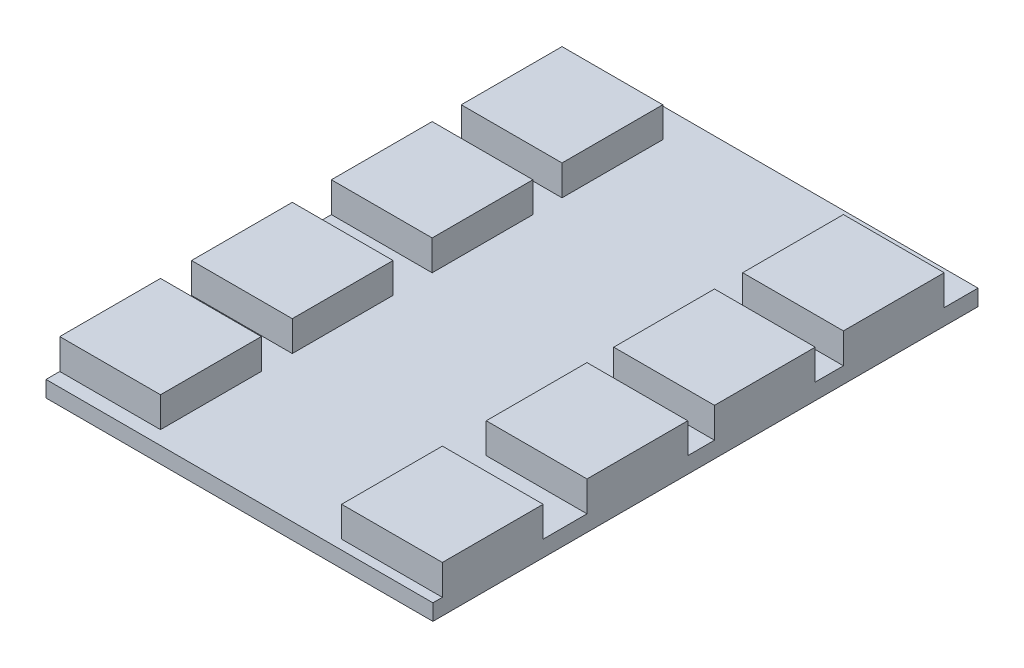
ISO-10303-21;
HEADER;
FILE_DESCRIPTION(('STEP AP214'),'2;1');
FILE_NAME('part.step','',(''),(''),'','','');
FILE_SCHEMA(('AUTOMOTIVE_DESIGN { 1 0 10303 214 1 1 1 1 }'));
ENDSEC;
DATA;
#1=APPLICATION_CONTEXT('core data for automotive mechanical design processes');
#2=APPLICATION_PROTOCOL_DEFINITION('international standard','automotive_design',2000,#1);
#3=PRODUCT_CONTEXT('',#1,'mechanical');
#4=PRODUCT('Part','Part','',(#3));
#5=PRODUCT_RELATED_PRODUCT_CATEGORY('part','',(#4));
#6=PRODUCT_DEFINITION_FORMATION('','',#4);
#7=PRODUCT_DEFINITION_CONTEXT('part definition',#1,'design');
#8=PRODUCT_DEFINITION('design','',#6,#7);
#9=PRODUCT_DEFINITION_SHAPE('','',#8);
#10=(LENGTH_UNIT() NAMED_UNIT(*) SI_UNIT(.MILLI.,.METRE.));
#11=(NAMED_UNIT(*) PLANE_ANGLE_UNIT() SI_UNIT($,.RADIAN.));
#12=(NAMED_UNIT(*) SI_UNIT($,.STERADIAN.) SOLID_ANGLE_UNIT());
#13=UNCERTAINTY_MEASURE_WITH_UNIT(LENGTH_MEASURE(1.E-05),#10,'distance_accuracy_value','');
#14=(GEOMETRIC_REPRESENTATION_CONTEXT(3) GLOBAL_UNCERTAINTY_ASSIGNED_CONTEXT((#13)) GLOBAL_UNIT_ASSIGNED_CONTEXT((#10,
#11,#12)) REPRESENTATION_CONTEXT('',''));
#15=CARTESIAN_POINT('',(0.,0.,0.));
#16=DIRECTION('',(0.,0.,1.));
#17=DIRECTION('',(1.,0.,0.));
#18=AXIS2_PLACEMENT_3D('',#15,#16,#17);
#19=CARTESIAN_POINT('',(0.,0.8,0.));
#20=DIRECTION('',(0.,-1.,0.));
#21=DIRECTION('',(0.,0.,-1.));
#22=AXIS2_PLACEMENT_3D('',#19,#20,#21);
#23=PLANE('',#22);
#24=DIRECTION('',(1.,0.,0.));
#25=VECTOR('',#24,1.);
#26=CARTESIAN_POINT('',(19.2,0.8,-13.6924671357661));
#27=LINE('',#26,#25);
#28=CARTESIAN_POINT('',(9.20000000000001,0.8,-13.6924671357661));
#29=VERTEX_POINT('',#28);
#30=CARTESIAN_POINT('',(19.2,0.8,-13.6924671357661));
#31=VERTEX_POINT('',#30);
#32=EDGE_CURVE('E60',#29,#31,#27,.T.);
#33=ORIENTED_EDGE('',*,*,#32,.F.);
#34=DIRECTION('',(0.,0.,1.));
#35=VECTOR('',#34,1.);
#36=CARTESIAN_POINT('',(9.20000000000001,0.8,-23.6924671357661));
#37=LINE('',#36,#35);
#38=CARTESIAN_POINT('',(9.20000000000001,0.8,-23.6924671357661));
#39=VERTEX_POINT('',#38);
#40=EDGE_CURVE('E417',#39,#29,#37,.T.);
#41=ORIENTED_EDGE('',*,*,#40,.F.);
#42=DIRECTION('',(-1.,0.,0.));
#43=VECTOR('',#42,1.);
#44=CARTESIAN_POINT('',(19.2,0.8,-23.6924671357661));
#45=LINE('',#44,#43);
#46=CARTESIAN_POINT('',(19.2,0.8,-23.6924671357661));
#47=VERTEX_POINT('',#46);
#48=EDGE_CURVE('E379',#47,#39,#45,.T.);
#49=ORIENTED_EDGE('',*,*,#48,.F.);
#50=DIRECTION('',(0.,0.,-1.));
#51=VECTOR('',#50,1.);
#52=CARTESIAN_POINT('',(19.2,0.8,27.05));
#53=LINE('',#52,#51);
#54=CARTESIAN_POINT('',(19.2,0.8,-27.05));
#55=VERTEX_POINT('',#54);
#56=EDGE_CURVE('E523',#47,#55,#53,.T.);
#57=ORIENTED_EDGE('',*,*,#56,.T.);
#58=DIRECTION('',(-1.,0.,0.));
#59=VECTOR('',#58,1.);
#60=CARTESIAN_POINT('',(-19.2,0.8,-27.05));
#61=LINE('',#60,#59);
#62=CARTESIAN_POINT('',(-19.2,0.8,-27.05));
#63=VERTEX_POINT('',#62);
#64=EDGE_CURVE('E521',#55,#63,#61,.T.);
#65=ORIENTED_EDGE('',*,*,#64,.T.);
#66=DIRECTION('',(0.,0.,1.));
#67=VECTOR('',#66,1.);
#68=CARTESIAN_POINT('',(-19.2,0.8,27.05));
#69=LINE('',#68,#67);
#70=CARTESIAN_POINT('',(-19.2,0.8,-24.1646211749305));
#71=VERTEX_POINT('',#70);
#72=EDGE_CURVE('E526',#63,#71,#69,.T.);
#73=ORIENTED_EDGE('',*,*,#72,.T.);
#74=DIRECTION('',(-1.,0.,0.));
#75=VECTOR('',#74,1.);
#76=CARTESIAN_POINT('',(-19.2,0.8,-24.1646211749305));
#77=LINE('',#76,#75);
#78=CARTESIAN_POINT('',(-9.2,0.8,-24.1646211749305));
#79=VERTEX_POINT('',#78);
#80=EDGE_CURVE('E493',#79,#71,#77,.T.);
#81=ORIENTED_EDGE('',*,*,#80,.F.);
#82=DIRECTION('',(0.,0.,-1.));
#83=VECTOR('',#82,1.);
#84=CARTESIAN_POINT('',(-9.2,0.8,-24.1646211749305));
#85=LINE('',#84,#83);
#86=CARTESIAN_POINT('',(-9.2,0.8,-14.1646211749305));
#87=VERTEX_POINT('',#86);
#88=EDGE_CURVE('E502',#87,#79,#85,.T.);
#89=ORIENTED_EDGE('',*,*,#88,.F.);
#90=DIRECTION('',(1.,0.,0.));
#91=VECTOR('',#90,1.);
#92=CARTESIAN_POINT('',(-19.2,0.8,-14.1646211749305));
#93=LINE('',#92,#91);
#94=CARTESIAN_POINT('',(-19.2,0.8,-14.1646211749305));
#95=VERTEX_POINT('',#94);
#96=EDGE_CURVE('E453',#95,#87,#93,.T.);
#97=ORIENTED_EDGE('',*,*,#96,.F.);
#98=CARTESIAN_POINT('',(-19.2,0.8,-11.2748159057438));
#99=VERTEX_POINT('',#98);
#100=EDGE_CURVE('E529',#95,#99,#69,.T.);
#101=ORIENTED_EDGE('',*,*,#100,.T.);
#102=DIRECTION('',(-1.,0.,0.));
#103=VECTOR('',#102,1.);
#104=CARTESIAN_POINT('',(-19.2,0.8,-11.2748159057438));
#105=LINE('',#104,#103);
#106=CARTESIAN_POINT('',(-9.2,0.8,-11.2748159057438));
#107=VERTEX_POINT('',#106);
#108=EDGE_CURVE('E443',#107,#99,#105,.T.);
#109=ORIENTED_EDGE('',*,*,#108,.F.);
#110=DIRECTION('',(0.,0.,-1.));
#111=VECTOR('',#110,1.);
#112=CARTESIAN_POINT('',(-9.2,0.8,-11.2748159057438));
#113=LINE('',#112,#111);
#114=CARTESIAN_POINT('',(-9.2,0.8,-1.27481590574375));
#115=VERTEX_POINT('',#114);
#116=EDGE_CURVE('E446',#115,#107,#113,.T.);
#117=ORIENTED_EDGE('',*,*,#116,.F.);
#118=DIRECTION('',(1.,0.,0.));
#119=VECTOR('',#118,1.);
#120=CARTESIAN_POINT('',(-19.2,0.8,-1.27481590574375));
#121=LINE('',#120,#119);
#122=CARTESIAN_POINT('',(-19.2,0.8,-1.27481590574375));
#123=VERTEX_POINT('',#122);
#124=EDGE_CURVE('E450',#123,#115,#121,.T.);
#125=ORIENTED_EDGE('',*,*,#124,.F.);
#126=CARTESIAN_POINT('',(-19.2,0.8,2.6065128456881));
#127=VERTEX_POINT('',#126);
#128=EDGE_CURVE('E1119',#123,#127,#69,.T.);
#129=ORIENTED_EDGE('',*,*,#128,.T.);
#130=DIRECTION('',(-1.,0.,0.));
#131=VECTOR('',#130,1.);
#132=CARTESIAN_POINT('',(-19.2,0.8,2.6065128456881));
#133=LINE('',#132,#131);
#134=CARTESIAN_POINT('',(-9.19999999999999,0.8,2.6065128456881));
#135=VERTEX_POINT('',#134);
#136=EDGE_CURVE('E473',#135,#127,#133,.T.);
#137=ORIENTED_EDGE('',*,*,#136,.F.);
#138=DIRECTION('',(0.,0.,-1.));
#139=VECTOR('',#138,1.);
#140=CARTESIAN_POINT('',(-9.19999999999999,0.8,2.6065128456881));
#141=LINE('',#140,#139);
#142=CARTESIAN_POINT('',(-9.2,0.8,12.6065128456881));
#143=VERTEX_POINT('',#142);
#144=EDGE_CURVE('E476',#143,#135,#141,.T.);
#145=ORIENTED_EDGE('',*,*,#144,.F.);
#146=DIRECTION('',(1.,0.,0.));
#147=VECTOR('',#146,1.);
#148=CARTESIAN_POINT('',(-19.2,0.8,12.6065128456881));
#149=LINE('',#148,#147);
#150=CARTESIAN_POINT('',(-19.2,0.8,12.6065128456881));
#151=VERTEX_POINT('',#150);
#152=EDGE_CURVE('E433',#151,#143,#149,.T.);
#153=ORIENTED_EDGE('',*,*,#152,.F.);
#154=CARTESIAN_POINT('',(-19.2,0.8,15.6851797305405));
#155=VERTEX_POINT('',#154);
#156=EDGE_CURVE('E1117',#151,#155,#69,.T.);
#157=ORIENTED_EDGE('',*,*,#156,.T.);
#158=DIRECTION('',(-1.,0.,0.));
#159=VECTOR('',#158,1.);
#160=CARTESIAN_POINT('',(-19.2,0.8,15.6851797305405));
#161=LINE('',#160,#159);
#162=CARTESIAN_POINT('',(-9.2,0.8,15.6851797305405));
#163=VERTEX_POINT('',#162);
#164=EDGE_CURVE('E67',#163,#155,#161,.T.);
#165=ORIENTED_EDGE('',*,*,#164,.F.);
#166=DIRECTION('',(0.,0.,-1.));
#167=VECTOR('',#166,1.);
#168=CARTESIAN_POINT('',(-9.2,0.8,15.6851797305405));
#169=LINE('',#168,#167);
#170=CARTESIAN_POINT('',(-9.19999999999999,0.8,25.6851797305405));
#171=VERTEX_POINT('',#170);
#172=EDGE_CURVE('E390',#171,#163,#169,.T.);
#173=ORIENTED_EDGE('',*,*,#172,.F.);
#174=DIRECTION('',(1.,0.,0.));
#175=VECTOR('',#174,1.);
#176=CARTESIAN_POINT('',(-19.2,0.8,25.6851797305405));
#177=LINE('',#176,#175);
#178=CARTESIAN_POINT('',(-19.2,0.8,25.6851797305405));
#179=VERTEX_POINT('',#178);
#180=EDGE_CURVE('E393',#179,#171,#177,.T.);
#181=ORIENTED_EDGE('',*,*,#180,.F.);
#182=CARTESIAN_POINT('',(-19.2,0.8,27.05));
#183=VERTEX_POINT('',#182);
#184=EDGE_CURVE('E525',#179,#183,#69,.T.);
#185=ORIENTED_EDGE('',*,*,#184,.T.);
#186=DIRECTION('',(1.,0.,0.));
#187=VECTOR('',#186,1.);
#188=CARTESIAN_POINT('',(-19.2,0.8,27.05));
#189=LINE('',#188,#187);
#190=CARTESIAN_POINT('',(19.2,0.8,27.05));
#191=VERTEX_POINT('',#190);
#192=EDGE_CURVE('E528',#183,#191,#189,.T.);
#193=ORIENTED_EDGE('',*,*,#192,.T.);
#194=CARTESIAN_POINT('',(19.2,0.8,26.1101183657885));
#195=VERTEX_POINT('',#194);
#196=EDGE_CURVE('E519',#191,#195,#53,.T.);
#197=ORIENTED_EDGE('',*,*,#196,.T.);
#198=DIRECTION('',(1.,0.,0.));
#199=VECTOR('',#198,1.);
#200=CARTESIAN_POINT('',(19.2,0.8,26.1101183657885));
#201=LINE('',#200,#199);
#202=CARTESIAN_POINT('',(9.20000000000002,0.8,26.1101183657885));
#203=VERTEX_POINT('',#202);
#204=EDGE_CURVE('E359',#203,#195,#201,.T.);
#205=ORIENTED_EDGE('',*,*,#204,.F.);
#206=DIRECTION('',(0.,0.,1.));
#207=VECTOR('',#206,1.);
#208=CARTESIAN_POINT('',(9.20000000000002,0.8,16.1101183657885));
#209=LINE('',#208,#207);
#210=CARTESIAN_POINT('',(9.20000000000002,0.8,16.1101183657885));
#211=VERTEX_POINT('',#210);
#212=EDGE_CURVE('E362',#211,#203,#209,.T.);
#213=ORIENTED_EDGE('',*,*,#212,.F.);
#214=DIRECTION('',(-1.,0.,0.));
#215=VECTOR('',#214,1.);
#216=CARTESIAN_POINT('',(19.2,0.8,16.1101183657885));
#217=LINE('',#216,#215);
#218=CARTESIAN_POINT('',(19.2,0.8,16.1101183657885));
#219=VERTEX_POINT('',#218);
#220=EDGE_CURVE('E320',#219,#211,#217,.T.);
#221=ORIENTED_EDGE('',*,*,#220,.F.);
#222=CARTESIAN_POINT('',(19.2,0.8,11.7566355751923));
#223=VERTEX_POINT('',#222);
#224=EDGE_CURVE('E522',#219,#223,#53,.T.);
#225=ORIENTED_EDGE('',*,*,#224,.T.);
#226=DIRECTION('',(1.,0.,0.));
#227=VECTOR('',#226,1.);
#228=CARTESIAN_POINT('',(19.2,0.8,11.7566355751923));
#229=LINE('',#228,#227);
#230=CARTESIAN_POINT('',(9.20000000000001,0.8,11.7566355751923));
#231=VERTEX_POINT('',#230);
#232=EDGE_CURVE('E330',#231,#223,#229,.T.);
#233=ORIENTED_EDGE('',*,*,#232,.F.);
#234=DIRECTION('',(0.,0.,1.));
#235=VECTOR('',#234,1.);
#236=CARTESIAN_POINT('',(9.20000000000001,0.8,1.75663557519226));
#237=LINE('',#236,#235);
#238=CARTESIAN_POINT('',(9.20000000000001,0.8,1.75663557519226));
#239=VERTEX_POINT('',#238);
#240=EDGE_CURVE('E333',#239,#231,#237,.T.);
#241=ORIENTED_EDGE('',*,*,#240,.F.);
#242=DIRECTION('',(-1.,0.,0.));
#243=VECTOR('',#242,1.);
#244=CARTESIAN_POINT('',(19.2,0.8,1.75663557519226));
#245=LINE('',#244,#243);
#246=CARTESIAN_POINT('',(19.2,0.8,1.75663557519226));
#247=VERTEX_POINT('',#246);
#248=EDGE_CURVE('E302',#247,#239,#245,.T.);
#249=ORIENTED_EDGE('',*,*,#248,.F.);
#250=CARTESIAN_POINT('',(19.2,0.8,-0.897092674412271));
#251=VERTEX_POINT('',#250);
#252=EDGE_CURVE('E580',#247,#251,#53,.T.);
#253=ORIENTED_EDGE('',*,*,#252,.T.);
#254=DIRECTION('',(1.,0.,0.));
#255=VECTOR('',#254,1.);
#256=CARTESIAN_POINT('',(19.2,0.8,-0.897092674412271));
#257=LINE('',#256,#255);
#258=CARTESIAN_POINT('',(9.20000000000001,0.8,-0.89709267441227));
#259=VERTEX_POINT('',#258);
#260=EDGE_CURVE('E280',#259,#251,#257,.T.);
#261=ORIENTED_EDGE('',*,*,#260,.F.);
#262=DIRECTION('',(0.,0.,1.));
#263=VECTOR('',#262,1.);
#264=CARTESIAN_POINT('',(9.20000000000001,0.8,-10.8970926744123));
#265=LINE('',#264,#263);
#266=CARTESIAN_POINT('',(9.20000000000001,0.8,-10.8970926744123));
#267=VERTEX_POINT('',#266);
#268=EDGE_CURVE('E275',#267,#259,#265,.T.);
#269=ORIENTED_EDGE('',*,*,#268,.F.);
#270=DIRECTION('',(-1.,0.,0.));
#271=VECTOR('',#270,1.);
#272=CARTESIAN_POINT('',(19.2,0.8,-10.8970926744123));
#273=LINE('',#272,#271);
#274=CARTESIAN_POINT('',(19.2,0.8,-10.8970926744123));
#275=VERTEX_POINT('',#274);
#276=EDGE_CURVE('E277',#275,#267,#273,.T.);
#277=ORIENTED_EDGE('',*,*,#276,.F.);
#278=EDGE_CURVE('E581',#275,#31,#53,.T.);
#279=ORIENTED_EDGE('',*,*,#278,.T.);
#280=EDGE_LOOP('',(#33,#41,#49,#57,#65,#73,#81,#89,#97,#101,#109,#117,#125,#129,#137,#145,#153,
#157,#165,#173,#181,#185,#193,#197,#205,#213,#221,#225,#233,#241,#249,#253,#261,#269,#277,#279));
#281=FACE_BOUND('',#280,.T.);
#282=ADVANCED_FACE('F45',(#281),#23,.F.);
#283=CARTESIAN_POINT('',(19.2,0.8,27.05));
#284=DIRECTION('',(-1.,0.,0.));
#285=DIRECTION('',(0.,0.,1.));
#286=AXIS2_PLACEMENT_3D('',#283,#284,#285);
#287=PLANE('',#286);
#288=DIRECTION('',(0.,0.,-1.));
#289=VECTOR('',#288,1.);
#290=CARTESIAN_POINT('',(19.2,-0.8,27.05));
#291=LINE('',#290,#289);
#292=CARTESIAN_POINT('',(19.2,-0.8,27.05));
#293=VERTEX_POINT('',#292);
#294=CARTESIAN_POINT('',(19.2,-0.8,-27.05));
#295=VERTEX_POINT('',#294);
#296=EDGE_CURVE('E518',#293,#295,#291,.T.);
#297=ORIENTED_EDGE('',*,*,#296,.T.);
#298=DIRECTION('',(0.,-1.,0.));
#299=VECTOR('',#298,1.);
#300=CARTESIAN_POINT('',(19.2,0.8,-27.05));
#301=LINE('',#300,#299);
#302=EDGE_CURVE('E11',#55,#295,#301,.T.);
#303=ORIENTED_EDGE('',*,*,#302,.F.);
#304=ORIENTED_EDGE('',*,*,#56,.F.);
#305=DIRECTION('',(0.,-1.,0.));
#306=VECTOR('',#305,1.);
#307=CARTESIAN_POINT('',(19.2,3.8,-23.6924671357661));
#308=LINE('',#307,#306);
#309=CARTESIAN_POINT('',(19.2,3.8,-23.6924671357661));
#310=VERTEX_POINT('',#309);
#311=EDGE_CURVE('E294',#310,#47,#308,.T.);
#312=ORIENTED_EDGE('',*,*,#311,.F.);
#313=DIRECTION('',(0.,0.,-1.));
#314=VECTOR('',#313,1.);
#315=CARTESIAN_POINT('',(19.2,3.8,-23.6924671357661));
#316=LINE('',#315,#314);
#317=CARTESIAN_POINT('',(19.2,3.8,-13.6924671357661));
#318=VERTEX_POINT('',#317);
#319=EDGE_CURVE('E418',#318,#310,#316,.T.);
#320=ORIENTED_EDGE('',*,*,#319,.F.);
#321=DIRECTION('',(0.,-1.,0.));
#322=VECTOR('',#321,1.);
#323=CARTESIAN_POINT('',(19.2,3.8,-13.6924671357661));
#324=LINE('',#323,#322);
#325=EDGE_CURVE('E412',#318,#31,#324,.T.);
#326=ORIENTED_EDGE('',*,*,#325,.T.);
#327=ORIENTED_EDGE('',*,*,#278,.F.);
#328=DIRECTION('',(0.,-1.,0.));
#329=VECTOR('',#328,1.);
#330=CARTESIAN_POINT('',(19.2,3.8,-10.8970926744123));
#331=LINE('',#330,#329);
#332=CARTESIAN_POINT('',(19.2,3.8,-10.8970926744123));
#333=VERTEX_POINT('',#332);
#334=EDGE_CURVE('E293',#333,#275,#331,.T.);
#335=ORIENTED_EDGE('',*,*,#334,.F.);
#336=DIRECTION('',(0.,0.,-1.));
#337=VECTOR('',#336,1.);
#338=CARTESIAN_POINT('',(19.2,3.8,-10.8970926744123));
#339=LINE('',#338,#337);
#340=CARTESIAN_POINT('',(19.2,3.8,-0.897092674412271));
#341=VERTEX_POINT('',#340);
#342=EDGE_CURVE('E308',#341,#333,#339,.T.);
#343=ORIENTED_EDGE('',*,*,#342,.F.);
#344=DIRECTION('',(0.,-1.,0.));
#345=VECTOR('',#344,1.);
#346=CARTESIAN_POINT('',(19.2,3.8,-0.897092674412271));
#347=LINE('',#346,#345);
#348=EDGE_CURVE('E300',#341,#251,#347,.T.);
#349=ORIENTED_EDGE('',*,*,#348,.T.);
#350=ORIENTED_EDGE('',*,*,#252,.F.);
#351=DIRECTION('',(0.,-1.,0.));
#352=VECTOR('',#351,1.);
#353=CARTESIAN_POINT('',(19.2,3.8,1.75663557519226));
#354=LINE('',#353,#352);
#355=CARTESIAN_POINT('',(19.2,3.8,1.75663557519226));
#356=VERTEX_POINT('',#355);
#357=EDGE_CURVE('E316',#356,#247,#354,.T.);
#358=ORIENTED_EDGE('',*,*,#357,.F.);
#359=DIRECTION('',(0.,0.,-1.));
#360=VECTOR('',#359,1.);
#361=CARTESIAN_POINT('',(19.2,3.8,1.75663557519226));
#362=LINE('',#361,#360);
#363=CARTESIAN_POINT('',(19.2,3.8,11.7566355751923));
#364=VERTEX_POINT('',#363);
#365=EDGE_CURVE('E334',#364,#356,#362,.T.);
#366=ORIENTED_EDGE('',*,*,#365,.F.);
#367=DIRECTION('',(0.,-1.,0.));
#368=VECTOR('',#367,1.);
#369=CARTESIAN_POINT('',(19.2,3.8,11.7566355751923));
#370=LINE('',#369,#368);
#371=EDGE_CURVE('E326',#364,#223,#370,.T.);
#372=ORIENTED_EDGE('',*,*,#371,.T.);
#373=ORIENTED_EDGE('',*,*,#224,.F.);
#374=DIRECTION('',(0.,-1.,0.));
#375=VECTOR('',#374,1.);
#376=CARTESIAN_POINT('',(19.2,3.8,16.1101183657885));
#377=LINE('',#376,#375);
#378=CARTESIAN_POINT('',(19.2,3.8,16.1101183657885));
#379=VERTEX_POINT('',#378);
#380=EDGE_CURVE('E346',#379,#219,#377,.T.);
#381=ORIENTED_EDGE('',*,*,#380,.F.);
#382=DIRECTION('',(0.,0.,-1.));
#383=VECTOR('',#382,1.);
#384=CARTESIAN_POINT('',(19.2,3.8,16.1101183657885));
#385=LINE('',#384,#383);
#386=CARTESIAN_POINT('',(19.2,3.8,26.1101183657885));
#387=VERTEX_POINT('',#386);
#388=EDGE_CURVE('E363',#387,#379,#385,.T.);
#389=ORIENTED_EDGE('',*,*,#388,.F.);
#390=DIRECTION('',(0.,-1.,0.));
#391=VECTOR('',#390,1.);
#392=CARTESIAN_POINT('',(19.2,3.8,26.1101183657885));
#393=LINE('',#392,#391);
#394=EDGE_CURVE('E355',#387,#195,#393,.T.);
#395=ORIENTED_EDGE('',*,*,#394,.T.);
#396=ORIENTED_EDGE('',*,*,#196,.F.);
#397=DIRECTION('',(0.,-1.,0.));
#398=VECTOR('',#397,1.);
#399=CARTESIAN_POINT('',(19.2,0.8,27.05));
#400=LINE('',#399,#398);
#401=EDGE_CURVE('E531',#191,#293,#400,.T.);
#402=ORIENTED_EDGE('',*,*,#401,.T.);
#403=EDGE_LOOP('',(#297,#303,#304,#312,#320,#326,#327,#335,#343,#349,#350,#358,#366,#372,#373,
#381,#389,#395,#396,#402));
#404=FACE_BOUND('',#403,.T.);
#405=ADVANCED_FACE('F47',(#404),#287,.F.);
#406=CARTESIAN_POINT('',(-19.2,0.8,-27.05));
#407=DIRECTION('',(0.,0.,1.));
#408=DIRECTION('',(1.,0.,0.));
#409=AXIS2_PLACEMENT_3D('',#406,#407,#408);
#410=PLANE('',#409);
#411=DIRECTION('',(-1.,0.,0.));
#412=VECTOR('',#411,1.);
#413=CARTESIAN_POINT('',(-19.2,-0.8,-27.05));
#414=LINE('',#413,#412);
#415=CARTESIAN_POINT('',(-19.2,-0.8,-27.05));
#416=VERTEX_POINT('',#415);
#417=EDGE_CURVE('E534',#295,#416,#414,.T.);
#418=ORIENTED_EDGE('',*,*,#417,.T.);
#419=DIRECTION('',(0.,-1.,0.));
#420=VECTOR('',#419,1.);
#421=CARTESIAN_POINT('',(-19.2,0.8,-27.05));
#422=LINE('',#421,#420);
#423=EDGE_CURVE('E53',#63,#416,#422,.T.);
#424=ORIENTED_EDGE('',*,*,#423,.F.);
#425=ORIENTED_EDGE('',*,*,#64,.F.);
#426=ORIENTED_EDGE('',*,*,#302,.T.);
#427=EDGE_LOOP('',(#418,#424,#425,#426));
#428=FACE_BOUND('',#427,.T.);
#429=ADVANCED_FACE('F585',(#428),#410,.F.);
#430=CARTESIAN_POINT('',(-19.2,0.8,27.05));
#431=DIRECTION('',(1.,0.,0.));
#432=DIRECTION('',(0.,0.,-1.));
#433=AXIS2_PLACEMENT_3D('',#430,#431,#432);
#434=PLANE('',#433);
#435=DIRECTION('',(0.,0.,1.));
#436=VECTOR('',#435,1.);
#437=CARTESIAN_POINT('',(-19.2,-0.8,27.05));
#438=LINE('',#437,#436);
#439=CARTESIAN_POINT('',(-19.2,-0.8,27.05));
#440=VERTEX_POINT('',#439);
#441=EDGE_CURVE('E536',#416,#440,#438,.T.);
#442=ORIENTED_EDGE('',*,*,#441,.T.);
#443=DIRECTION('',(0.,-1.,0.));
#444=VECTOR('',#443,1.);
#445=CARTESIAN_POINT('',(-19.2,0.8,27.05));
#446=LINE('',#445,#444);
#447=EDGE_CURVE('E542',#183,#440,#446,.T.);
#448=ORIENTED_EDGE('',*,*,#447,.F.);
#449=ORIENTED_EDGE('',*,*,#184,.F.);
#450=DIRECTION('',(0.,-1.,0.));
#451=VECTOR('',#450,1.);
#452=CARTESIAN_POINT('',(-19.2,3.8,25.6851797305405));
#453=LINE('',#452,#451);
#454=CARTESIAN_POINT('',(-19.2,3.8,25.6851797305405));
#455=VERTEX_POINT('',#454);
#456=EDGE_CURVE('E375',#455,#179,#453,.T.);
#457=ORIENTED_EDGE('',*,*,#456,.F.);
#458=DIRECTION('',(0.,0.,1.));
#459=VECTOR('',#458,1.);
#460=CARTESIAN_POINT('',(-19.2,3.8,15.6851797305405));
#461=LINE('',#460,#459);
#462=CARTESIAN_POINT('',(-19.2,3.8,15.6851797305405));
#463=VERTEX_POINT('',#462);
#464=EDGE_CURVE('E391',#463,#455,#461,.T.);
#465=ORIENTED_EDGE('',*,*,#464,.F.);
#466=DIRECTION('',(0.,-1.,0.));
#467=VECTOR('',#466,1.);
#468=CARTESIAN_POINT('',(-19.2,3.8,15.6851797305405));
#469=LINE('',#468,#467);
#470=EDGE_CURVE('E385',#463,#155,#469,.T.);
#471=ORIENTED_EDGE('',*,*,#470,.T.);
#472=ORIENTED_EDGE('',*,*,#156,.F.);
#473=DIRECTION('',(0.,-1.,0.));
#474=VECTOR('',#473,1.);
#475=CARTESIAN_POINT('',(-19.2,3.8,12.6065128456881));
#476=LINE('',#475,#474);
#477=CARTESIAN_POINT('',(-19.2,3.8,12.6065128456881));
#478=VERTEX_POINT('',#477);
#479=EDGE_CURVE('E396',#478,#151,#476,.T.);
#480=ORIENTED_EDGE('',*,*,#479,.F.);
#481=DIRECTION('',(0.,0.,1.));
#482=VECTOR('',#481,1.);
#483=CARTESIAN_POINT('',(-19.2,3.8,2.6065128456881));
#484=LINE('',#483,#482);
#485=CARTESIAN_POINT('',(-19.2,3.8,2.6065128456881));
#486=VERTEX_POINT('',#485);
#487=EDGE_CURVE('E477',#486,#478,#484,.T.);
#488=ORIENTED_EDGE('',*,*,#487,.F.);
#489=DIRECTION('',(0.,-1.,0.));
#490=VECTOR('',#489,1.);
#491=CARTESIAN_POINT('',(-19.2,3.8,2.6065128456881));
#492=LINE('',#491,#490);
#493=EDGE_CURVE('E469',#486,#127,#492,.T.);
#494=ORIENTED_EDGE('',*,*,#493,.T.);
#495=ORIENTED_EDGE('',*,*,#128,.F.);
#496=DIRECTION('',(0.,-1.,0.));
#497=VECTOR('',#496,1.);
#498=CARTESIAN_POINT('',(-19.2,3.8,-1.27481590574375));
#499=LINE('',#498,#497);
#500=CARTESIAN_POINT('',(-19.2,3.8,-1.27481590574375));
#501=VERTEX_POINT('',#500);
#502=EDGE_CURVE('E429',#501,#123,#499,.T.);
#503=ORIENTED_EDGE('',*,*,#502,.F.);
#504=DIRECTION('',(0.,0.,1.));
#505=VECTOR('',#504,1.);
#506=CARTESIAN_POINT('',(-19.2,3.8,-11.2748159057438));
#507=LINE('',#506,#505);
#508=CARTESIAN_POINT('',(-19.2,3.8,-11.2748159057438));
#509=VERTEX_POINT('',#508);
#510=EDGE_CURVE('E447',#509,#501,#507,.T.);
#511=ORIENTED_EDGE('',*,*,#510,.F.);
#512=DIRECTION('',(0.,-1.,0.));
#513=VECTOR('',#512,1.);
#514=CARTESIAN_POINT('',(-19.2,3.8,-11.2748159057438));
#515=LINE('',#514,#513);
#516=EDGE_CURVE('E439',#509,#99,#515,.T.);
#517=ORIENTED_EDGE('',*,*,#516,.T.);
#518=ORIENTED_EDGE('',*,*,#100,.F.);
#519=DIRECTION('',(0.,-1.,0.));
#520=VECTOR('',#519,1.);
#521=CARTESIAN_POINT('',(-19.2,3.8,-14.1646211749305));
#522=LINE('',#521,#520);
#523=CARTESIAN_POINT('',(-19.2,3.8,-14.1646211749305));
#524=VERTEX_POINT('',#523);
#525=EDGE_CURVE('E515',#524,#95,#522,.T.);
#526=ORIENTED_EDGE('',*,*,#525,.F.);
#527=DIRECTION('',(0.,0.,1.));
#528=VECTOR('',#527,1.);
#529=CARTESIAN_POINT('',(-19.2,3.8,-24.1646211749305));
#530=LINE('',#529,#528);
#531=CARTESIAN_POINT('',(-19.2,3.8,-24.1646211749305));
#532=VERTEX_POINT('',#531);
#533=EDGE_CURVE('E489',#532,#524,#530,.T.);
#534=ORIENTED_EDGE('',*,*,#533,.F.);
#535=DIRECTION('',(0.,-1.,0.));
#536=VECTOR('',#535,1.);
#537=CARTESIAN_POINT('',(-19.2,3.8,-24.1646211749305));
#538=LINE('',#537,#536);
#539=EDGE_CURVE('E499',#532,#71,#538,.T.);
#540=ORIENTED_EDGE('',*,*,#539,.T.);
#541=ORIENTED_EDGE('',*,*,#72,.F.);
#542=ORIENTED_EDGE('',*,*,#423,.T.);
#543=EDGE_LOOP('',(#442,#448,#449,#457,#465,#471,#472,#480,#488,#494,#495,#503,#511,#517,#518,
#526,#534,#540,#541,#542));
#544=FACE_BOUND('',#543,.T.);
#545=ADVANCED_FACE('F549',(#544),#434,.F.);
#546=CARTESIAN_POINT('',(-19.2,0.8,27.05));
#547=DIRECTION('',(0.,0.,-1.));
#548=DIRECTION('',(-1.,0.,0.));
#549=AXIS2_PLACEMENT_3D('',#546,#547,#548);
#550=PLANE('',#549);
#551=DIRECTION('',(1.,0.,0.));
#552=VECTOR('',#551,1.);
#553=CARTESIAN_POINT('',(-19.2,-0.8,27.05));
#554=LINE('',#553,#552);
#555=EDGE_CURVE('E538',#440,#293,#554,.T.);
#556=ORIENTED_EDGE('',*,*,#555,.T.);
#557=ORIENTED_EDGE('',*,*,#401,.F.);
#558=ORIENTED_EDGE('',*,*,#192,.F.);
#559=ORIENTED_EDGE('',*,*,#447,.T.);
#560=EDGE_LOOP('',(#556,#557,#558,#559));
#561=FACE_BOUND('',#560,.T.);
#562=ADVANCED_FACE('F559',(#561),#550,.F.);
#563=CARTESIAN_POINT('',(0.,-0.8,0.));
#564=DIRECTION('',(0.,-1.,0.));
#565=DIRECTION('',(0.,0.,-1.));
#566=AXIS2_PLACEMENT_3D('',#563,#564,#565);
#567=PLANE('',#566);
#568=ORIENTED_EDGE('',*,*,#296,.F.);
#569=ORIENTED_EDGE('',*,*,#555,.F.);
#570=ORIENTED_EDGE('',*,*,#441,.F.);
#571=ORIENTED_EDGE('',*,*,#417,.F.);
#572=EDGE_LOOP('',(#568,#569,#570,#571));
#573=FACE_BOUND('',#572,.T.);
#574=ADVANCED_FACE('F556',(#573),#567,.T.);
#575=CARTESIAN_POINT('',(-19.2,3.8,-14.1646211749305));
#576=DIRECTION('',(0.,0.,-1.));
#577=DIRECTION('',(-1.,0.,0.));
#578=AXIS2_PLACEMENT_3D('',#575,#576,#577);
#579=PLANE('',#578);
#580=ORIENTED_EDGE('',*,*,#96,.T.);
#581=DIRECTION('',(0.,-1.,0.));
#582=VECTOR('',#581,1.);
#583=CARTESIAN_POINT('',(-9.2,3.8,-14.1646211749305));
#584=LINE('',#583,#582);
#585=CARTESIAN_POINT('',(-9.2,3.8,-14.1646211749305));
#586=VERTEX_POINT('',#585);
#587=EDGE_CURVE('E512',#586,#87,#584,.T.);
#588=ORIENTED_EDGE('',*,*,#587,.F.);
#589=DIRECTION('',(1.,0.,0.));
#590=VECTOR('',#589,1.);
#591=CARTESIAN_POINT('',(-19.2,3.8,-14.1646211749305));
#592=LINE('',#591,#590);
#593=EDGE_CURVE('E492',#524,#586,#592,.T.);
#594=ORIENTED_EDGE('',*,*,#593,.F.);
#595=ORIENTED_EDGE('',*,*,#525,.T.);
#596=EDGE_LOOP('',(#580,#588,#594,#595));
#597=FACE_BOUND('',#596,.T.);
#598=ADVANCED_FACE('F600',(#597),#579,.F.);
#599=CARTESIAN_POINT('',(-9.2,3.8,-24.1646211749305));
#600=DIRECTION('',(-1.,0.,0.));
#601=DIRECTION('',(0.,0.,1.));
#602=AXIS2_PLACEMENT_3D('',#599,#600,#601);
#603=PLANE('',#602);
#604=ORIENTED_EDGE('',*,*,#88,.T.);
#605=DIRECTION('',(0.,-1.,0.));
#606=VECTOR('',#605,1.);
#607=CARTESIAN_POINT('',(-9.2,3.8,-24.1646211749305));
#608=LINE('',#607,#606);
#609=CARTESIAN_POINT('',(-9.2,3.8,-24.1646211749305));
#610=VERTEX_POINT('',#609);
#611=EDGE_CURVE('E509',#610,#79,#608,.T.);
#612=ORIENTED_EDGE('',*,*,#611,.F.);
#613=DIRECTION('',(0.,0.,-1.));
#614=VECTOR('',#613,1.);
#615=CARTESIAN_POINT('',(-9.2,3.8,-24.1646211749305));
#616=LINE('',#615,#614);
#617=EDGE_CURVE('E495',#586,#610,#616,.T.);
#618=ORIENTED_EDGE('',*,*,#617,.F.);
#619=ORIENTED_EDGE('',*,*,#587,.T.);
#620=EDGE_LOOP('',(#604,#612,#618,#619));
#621=FACE_BOUND('',#620,.T.);
#622=ADVANCED_FACE('F659',(#621),#603,.F.);
#623=CARTESIAN_POINT('',(-19.2,3.8,-24.1646211749305));
#624=DIRECTION('',(0.,0.,1.));
#625=DIRECTION('',(1.,0.,0.));
#626=AXIS2_PLACEMENT_3D('',#623,#624,#625);
#627=PLANE('',#626);
#628=ORIENTED_EDGE('',*,*,#80,.T.);
#629=ORIENTED_EDGE('',*,*,#539,.F.);
#630=DIRECTION('',(-1.,0.,0.));
#631=VECTOR('',#630,1.);
#632=CARTESIAN_POINT('',(-19.2,3.8,-24.1646211749305));
#633=LINE('',#632,#631);
#634=EDGE_CURVE('E497',#610,#532,#633,.T.);
#635=ORIENTED_EDGE('',*,*,#634,.F.);
#636=ORIENTED_EDGE('',*,*,#611,.T.);
#637=EDGE_LOOP('',(#628,#629,#635,#636));
#638=FACE_BOUND('',#637,.T.);
#639=ADVANCED_FACE('F670',(#638),#627,.F.);
#640=CARTESIAN_POINT('',(0.,3.8,0.));
#641=DIRECTION('',(0.,1.,0.));
#642=DIRECTION('',(0.,0.,1.));
#643=AXIS2_PLACEMENT_3D('',#640,#641,#642);
#644=PLANE('',#643);
#645=ORIENTED_EDGE('',*,*,#533,.T.);
#646=ORIENTED_EDGE('',*,*,#593,.T.);
#647=ORIENTED_EDGE('',*,*,#617,.T.);
#648=ORIENTED_EDGE('',*,*,#634,.T.);
#649=EDGE_LOOP('',(#645,#646,#647,#648));
#650=FACE_BOUND('',#649,.T.);
#651=ADVANCED_FACE('F681',(#650),#644,.T.);
#652=CARTESIAN_POINT('',(19.2,3.8,16.1101183657885));
#653=DIRECTION('',(0.,0.,1.));
#654=DIRECTION('',(1.,0.,0.));
#655=AXIS2_PLACEMENT_3D('',#652,#653,#654);
#656=PLANE('',#655);
#657=ORIENTED_EDGE('',*,*,#220,.T.);
#658=DIRECTION('',(0.,-1.,0.));
#659=VECTOR('',#658,1.);
#660=CARTESIAN_POINT('',(9.20000000000002,3.8,16.1101183657885));
#661=LINE('',#660,#659);
#662=CARTESIAN_POINT('',(9.20000000000002,3.8,16.1101183657885));
#663=VERTEX_POINT('',#662);
#664=EDGE_CURVE('E349',#663,#211,#661,.T.);
#665=ORIENTED_EDGE('',*,*,#664,.F.);
#666=DIRECTION('',(-1.,0.,0.));
#667=VECTOR('',#666,1.);
#668=CARTESIAN_POINT('',(19.2,3.8,16.1101183657885));
#669=LINE('',#668,#667);
#670=EDGE_CURVE('E371',#379,#663,#669,.T.);
#671=ORIENTED_EDGE('',*,*,#670,.F.);
#672=ORIENTED_EDGE('',*,*,#380,.T.);
#673=EDGE_LOOP('',(#657,#665,#671,#672));
#674=FACE_BOUND('',#673,.T.);
#675=ADVANCED_FACE('F576',(#674),#656,.F.);
#676=CARTESIAN_POINT('',(9.20000000000002,3.8,16.1101183657885));
#677=DIRECTION('',(1.,0.,0.));
#678=DIRECTION('',(0.,0.,-1.));
#679=AXIS2_PLACEMENT_3D('',#676,#677,#678);
#680=PLANE('',#679);
#681=ORIENTED_EDGE('',*,*,#212,.T.);
#682=DIRECTION('',(0.,-1.,0.));
#683=VECTOR('',#682,1.);
#684=CARTESIAN_POINT('',(9.20000000000002,3.8,26.1101183657885));
#685=LINE('',#684,#683);
#686=CARTESIAN_POINT('',(9.20000000000002,3.8,26.1101183657885));
#687=VERTEX_POINT('',#686);
#688=EDGE_CURVE('E352',#687,#203,#685,.T.);
#689=ORIENTED_EDGE('',*,*,#688,.F.);
#690=DIRECTION('',(0.,0.,1.));
#691=VECTOR('',#690,1.);
#692=CARTESIAN_POINT('',(9.20000000000002,3.8,16.1101183657885));
#693=LINE('',#692,#691);
#694=EDGE_CURVE('E369',#663,#687,#693,.T.);
#695=ORIENTED_EDGE('',*,*,#694,.F.);
#696=ORIENTED_EDGE('',*,*,#664,.T.);
#697=EDGE_LOOP('',(#681,#689,#695,#696));
#698=FACE_BOUND('',#697,.T.);
#699=ADVANCED_FACE('F572',(#698),#680,.F.);
#700=CARTESIAN_POINT('',(19.2,3.8,26.1101183657885));
#701=DIRECTION('',(0.,0.,-1.));
#702=DIRECTION('',(-1.,0.,0.));
#703=AXIS2_PLACEMENT_3D('',#700,#701,#702);
#704=PLANE('',#703);
#705=ORIENTED_EDGE('',*,*,#204,.T.);
#706=ORIENTED_EDGE('',*,*,#394,.F.);
#707=DIRECTION('',(1.,0.,0.));
#708=VECTOR('',#707,1.);
#709=CARTESIAN_POINT('',(19.2,3.8,26.1101183657885));
#710=LINE('',#709,#708);
#711=EDGE_CURVE('E358',#687,#387,#710,.T.);
#712=ORIENTED_EDGE('',*,*,#711,.F.);
#713=ORIENTED_EDGE('',*,*,#688,.T.);
#714=EDGE_LOOP('',(#705,#706,#712,#713));
#715=FACE_BOUND('',#714,.T.);
#716=ADVANCED_FACE('F567',(#715),#704,.F.);
#717=CARTESIAN_POINT('',(0.,3.8,0.));
#718=DIRECTION('',(0.,-1.,0.));
#719=DIRECTION('',(0.,0.,-1.));
#720=AXIS2_PLACEMENT_3D('',#717,#718,#719);
#721=PLANE('',#720);
#722=ORIENTED_EDGE('',*,*,#388,.T.);
#723=ORIENTED_EDGE('',*,*,#670,.T.);
#724=ORIENTED_EDGE('',*,*,#694,.T.);
#725=ORIENTED_EDGE('',*,*,#711,.T.);
#726=EDGE_LOOP('',(#722,#723,#724,#725));
#727=FACE_BOUND('',#726,.T.);
#728=ADVANCED_FACE('F724',(#727),#721,.F.);
#729=CARTESIAN_POINT('',(19.2,3.8,1.75663557519226));
#730=DIRECTION('',(0.,0.,1.));
#731=DIRECTION('',(1.,0.,0.));
#732=AXIS2_PLACEMENT_3D('',#729,#730,#731);
#733=PLANE('',#732);
#734=ORIENTED_EDGE('',*,*,#248,.T.);
#735=DIRECTION('',(0.,-1.,0.));
#736=VECTOR('',#735,1.);
#737=CARTESIAN_POINT('',(9.20000000000001,3.8,1.75663557519226));
#738=LINE('',#737,#736);
#739=CARTESIAN_POINT('',(9.20000000000001,3.8,1.75663557519226));
#740=VERTEX_POINT('',#739);
#741=EDGE_CURVE('E319',#740,#239,#738,.T.);
#742=ORIENTED_EDGE('',*,*,#741,.F.);
#743=DIRECTION('',(-1.,0.,0.));
#744=VECTOR('',#743,1.);
#745=CARTESIAN_POINT('',(19.2,3.8,1.75663557519226));
#746=LINE('',#745,#744);
#747=EDGE_CURVE('E342',#356,#740,#746,.T.);
#748=ORIENTED_EDGE('',*,*,#747,.F.);
#749=ORIENTED_EDGE('',*,*,#357,.T.);
#750=EDGE_LOOP('',(#734,#742,#748,#749));
#751=FACE_BOUND('',#750,.T.);
#752=ADVANCED_FACE('F735',(#751),#733,.F.);
#753=CARTESIAN_POINT('',(9.20000000000001,3.8,1.75663557519226));
#754=DIRECTION('',(1.,0.,0.));
#755=DIRECTION('',(0.,0.,-1.));
#756=AXIS2_PLACEMENT_3D('',#753,#754,#755);
#757=PLANE('',#756);
#758=ORIENTED_EDGE('',*,*,#240,.T.);
#759=DIRECTION('',(0.,-1.,0.));
#760=VECTOR('',#759,1.);
#761=CARTESIAN_POINT('',(9.20000000000001,3.8,11.7566355751923));
#762=LINE('',#761,#760);
#763=CARTESIAN_POINT('',(9.20000000000001,3.8,11.7566355751923));
#764=VERTEX_POINT('',#763);
#765=EDGE_CURVE('E323',#764,#231,#762,.T.);
#766=ORIENTED_EDGE('',*,*,#765,.F.);
#767=DIRECTION('',(0.,0.,1.));
#768=VECTOR('',#767,1.);
#769=CARTESIAN_POINT('',(9.20000000000001,3.8,1.75663557519226));
#770=LINE('',#769,#768);
#771=EDGE_CURVE('E340',#740,#764,#770,.T.);
#772=ORIENTED_EDGE('',*,*,#771,.F.);
#773=ORIENTED_EDGE('',*,*,#741,.T.);
#774=EDGE_LOOP('',(#758,#766,#772,#773));
#775=FACE_BOUND('',#774,.T.);
#776=ADVANCED_FACE('F747',(#775),#757,.F.);
#777=CARTESIAN_POINT('',(19.2,3.8,11.7566355751923));
#778=DIRECTION('',(0.,0.,-1.));
#779=DIRECTION('',(-1.,0.,0.));
#780=AXIS2_PLACEMENT_3D('',#777,#778,#779);
#781=PLANE('',#780);
#782=ORIENTED_EDGE('',*,*,#232,.T.);
#783=ORIENTED_EDGE('',*,*,#371,.F.);
#784=DIRECTION('',(1.,0.,0.));
#785=VECTOR('',#784,1.);
#786=CARTESIAN_POINT('',(19.2,3.8,11.7566355751923));
#787=LINE('',#786,#785);
#788=EDGE_CURVE('E329',#764,#364,#787,.T.);
#789=ORIENTED_EDGE('',*,*,#788,.F.);
#790=ORIENTED_EDGE('',*,*,#765,.T.);
#791=EDGE_LOOP('',(#782,#783,#789,#790));
#792=FACE_BOUND('',#791,.T.);
#793=ADVANCED_FACE('F759',(#792),#781,.F.);
#794=CARTESIAN_POINT('',(0.,3.8,0.));
#795=DIRECTION('',(0.,-1.,0.));
#796=DIRECTION('',(0.,0.,-1.));
#797=AXIS2_PLACEMENT_3D('',#794,#795,#796);
#798=PLANE('',#797);
#799=ORIENTED_EDGE('',*,*,#365,.T.);
#800=ORIENTED_EDGE('',*,*,#747,.T.);
#801=ORIENTED_EDGE('',*,*,#771,.T.);
#802=ORIENTED_EDGE('',*,*,#788,.T.);
#803=EDGE_LOOP('',(#799,#800,#801,#802));
#804=FACE_BOUND('',#803,.T.);
#805=ADVANCED_FACE('F771',(#804),#798,.F.);
#806=CARTESIAN_POINT('',(19.2,3.8,-10.8970926744123));
#807=DIRECTION('',(0.,0.,1.));
#808=DIRECTION('',(1.,0.,0.));
#809=AXIS2_PLACEMENT_3D('',#806,#807,#808);
#810=PLANE('',#809);
#811=ORIENTED_EDGE('',*,*,#276,.T.);
#812=DIRECTION('',(0.,-1.,0.));
#813=VECTOR('',#812,1.);
#814=CARTESIAN_POINT('',(9.20000000000001,3.8,-10.8970926744123));
#815=LINE('',#814,#813);
#816=CARTESIAN_POINT('',(9.20000000000001,3.8,-10.8970926744123));
#817=VERTEX_POINT('',#816);
#818=EDGE_CURVE('E290',#817,#267,#815,.T.);
#819=ORIENTED_EDGE('',*,*,#818,.F.);
#820=DIRECTION('',(-1.,0.,0.));
#821=VECTOR('',#820,1.);
#822=CARTESIAN_POINT('',(19.2,3.8,-10.8970926744123));
#823=LINE('',#822,#821);
#824=EDGE_CURVE('E312',#333,#817,#823,.T.);
#825=ORIENTED_EDGE('',*,*,#824,.F.);
#826=ORIENTED_EDGE('',*,*,#334,.T.);
#827=EDGE_LOOP('',(#811,#819,#825,#826));
#828=FACE_BOUND('',#827,.T.);
#829=ADVANCED_FACE('F289',(#828),#810,.F.);
#830=CARTESIAN_POINT('',(9.20000000000001,3.8,-10.8970926744123));
#831=DIRECTION('',(1.,0.,0.));
#832=DIRECTION('',(0.,0.,-1.));
#833=AXIS2_PLACEMENT_3D('',#830,#831,#832);
#834=PLANE('',#833);
#835=ORIENTED_EDGE('',*,*,#268,.T.);
#836=DIRECTION('',(0.,-1.,0.));
#837=VECTOR('',#836,1.);
#838=CARTESIAN_POINT('',(9.20000000000001,3.8,-0.89709267441227));
#839=LINE('',#838,#837);
#840=CARTESIAN_POINT('',(9.20000000000001,3.8,-0.89709267441227));
#841=VERTEX_POINT('',#840);
#842=EDGE_CURVE('E298',#841,#259,#839,.T.);
#843=ORIENTED_EDGE('',*,*,#842,.F.);
#844=DIRECTION('',(0.,0.,1.));
#845=VECTOR('',#844,1.);
#846=CARTESIAN_POINT('',(9.20000000000001,3.8,-10.8970926744123));
#847=LINE('',#846,#845);
#848=EDGE_CURVE('E297',#817,#841,#847,.T.);
#849=ORIENTED_EDGE('',*,*,#848,.F.);
#850=ORIENTED_EDGE('',*,*,#818,.T.);
#851=EDGE_LOOP('',(#835,#843,#849,#850));
#852=FACE_BOUND('',#851,.T.);
#853=ADVANCED_FACE('F296',(#852),#834,.F.);
#854=CARTESIAN_POINT('',(19.2,3.8,-0.897092674412271));
#855=DIRECTION('',(0.,0.,-1.));
#856=DIRECTION('',(-1.,0.,0.));
#857=AXIS2_PLACEMENT_3D('',#854,#855,#856);
#858=PLANE('',#857);
#859=ORIENTED_EDGE('',*,*,#260,.T.);
#860=ORIENTED_EDGE('',*,*,#348,.F.);
#861=DIRECTION('',(1.,0.,0.));
#862=VECTOR('',#861,1.);
#863=CARTESIAN_POINT('',(19.2,3.8,-0.897092674412271));
#864=LINE('',#863,#862);
#865=EDGE_CURVE('E307',#841,#341,#864,.T.);
#866=ORIENTED_EDGE('',*,*,#865,.F.);
#867=ORIENTED_EDGE('',*,*,#842,.T.);
#868=EDGE_LOOP('',(#859,#860,#866,#867));
#869=FACE_BOUND('',#868,.T.);
#870=ADVANCED_FACE('F804',(#869),#858,.F.);
#871=CARTESIAN_POINT('',(0.,3.8,0.));
#872=DIRECTION('',(0.,-1.,0.));
#873=DIRECTION('',(0.,0.,-1.));
#874=AXIS2_PLACEMENT_3D('',#871,#872,#873);
#875=PLANE('',#874);
#876=ORIENTED_EDGE('',*,*,#342,.T.);
#877=ORIENTED_EDGE('',*,*,#824,.T.);
#878=ORIENTED_EDGE('',*,*,#848,.T.);
#879=ORIENTED_EDGE('',*,*,#865,.T.);
#880=EDGE_LOOP('',(#876,#877,#878,#879));
#881=FACE_BOUND('',#880,.T.);
#882=ADVANCED_FACE('F815',(#881),#875,.F.);
#883=CARTESIAN_POINT('',(-19.2,3.8,-1.27481590574375));
#884=DIRECTION('',(0.,0.,-1.));
#885=DIRECTION('',(-1.,0.,0.));
#886=AXIS2_PLACEMENT_3D('',#883,#884,#885);
#887=PLANE('',#886);
#888=ORIENTED_EDGE('',*,*,#124,.T.);
#889=DIRECTION('',(0.,-1.,0.));
#890=VECTOR('',#889,1.);
#891=CARTESIAN_POINT('',(-9.2,3.8,-1.27481590574375));
#892=LINE('',#891,#890);
#893=CARTESIAN_POINT('',(-9.2,3.8,-1.27481590574375));
#894=VERTEX_POINT('',#893);
#895=EDGE_CURVE('E432',#894,#115,#892,.T.);
#896=ORIENTED_EDGE('',*,*,#895,.F.);
#897=DIRECTION('',(1.,0.,0.));
#898=VECTOR('',#897,1.);
#899=CARTESIAN_POINT('',(-19.2,3.8,-1.27481590574375));
#900=LINE('',#899,#898);
#901=EDGE_CURVE('E457',#501,#894,#900,.T.);
#902=ORIENTED_EDGE('',*,*,#901,.F.);
#903=ORIENTED_EDGE('',*,*,#502,.T.);
#904=EDGE_LOOP('',(#888,#896,#902,#903));
#905=FACE_BOUND('',#904,.T.);
#906=ADVANCED_FACE('F827',(#905),#887,.F.);
#907=CARTESIAN_POINT('',(-9.2,3.8,-11.2748159057438));
#908=DIRECTION('',(-1.,0.,0.));
#909=DIRECTION('',(0.,0.,1.));
#910=AXIS2_PLACEMENT_3D('',#907,#908,#909);
#911=PLANE('',#910);
#912=ORIENTED_EDGE('',*,*,#116,.T.);
#913=DIRECTION('',(0.,-1.,0.));
#914=VECTOR('',#913,1.);
#915=CARTESIAN_POINT('',(-9.2,3.8,-11.2748159057438));
#916=LINE('',#915,#914);
#917=CARTESIAN_POINT('',(-9.2,3.8,-11.2748159057438));
#918=VERTEX_POINT('',#917);
#919=EDGE_CURVE('E436',#918,#107,#916,.T.);
#920=ORIENTED_EDGE('',*,*,#919,.F.);
#921=DIRECTION('',(0.,0.,-1.));
#922=VECTOR('',#921,1.);
#923=CARTESIAN_POINT('',(-9.2,3.8,-11.2748159057438));
#924=LINE('',#923,#922);
#925=EDGE_CURVE('E455',#894,#918,#924,.T.);
#926=ORIENTED_EDGE('',*,*,#925,.F.);
#927=ORIENTED_EDGE('',*,*,#895,.T.);
#928=EDGE_LOOP('',(#912,#920,#926,#927));
#929=FACE_BOUND('',#928,.T.);
#930=ADVANCED_FACE('F839',(#929),#911,.F.);
#931=CARTESIAN_POINT('',(-19.2,3.8,-11.2748159057438));
#932=DIRECTION('',(0.,0.,1.));
#933=DIRECTION('',(1.,0.,0.));
#934=AXIS2_PLACEMENT_3D('',#931,#932,#933);
#935=PLANE('',#934);
#936=ORIENTED_EDGE('',*,*,#108,.T.);
#937=ORIENTED_EDGE('',*,*,#516,.F.);
#938=DIRECTION('',(-1.,0.,0.));
#939=VECTOR('',#938,1.);
#940=CARTESIAN_POINT('',(-19.2,3.8,-11.2748159057438));
#941=LINE('',#940,#939);
#942=EDGE_CURVE('E442',#918,#509,#941,.T.);
#943=ORIENTED_EDGE('',*,*,#942,.F.);
#944=ORIENTED_EDGE('',*,*,#919,.T.);
#945=EDGE_LOOP('',(#936,#937,#943,#944));
#946=FACE_BOUND('',#945,.T.);
#947=ADVANCED_FACE('F851',(#946),#935,.F.);
#948=CARTESIAN_POINT('',(0.,3.8,0.));
#949=DIRECTION('',(0.,1.,0.));
#950=DIRECTION('',(0.,0.,1.));
#951=AXIS2_PLACEMENT_3D('',#948,#949,#950);
#952=PLANE('',#951);
#953=ORIENTED_EDGE('',*,*,#510,.T.);
#954=ORIENTED_EDGE('',*,*,#901,.T.);
#955=ORIENTED_EDGE('',*,*,#925,.T.);
#956=ORIENTED_EDGE('',*,*,#942,.T.);
#957=EDGE_LOOP('',(#953,#954,#955,#956));
#958=FACE_BOUND('',#957,.T.);
#959=ADVANCED_FACE('F863',(#958),#952,.T.);
#960=CARTESIAN_POINT('',(-19.2,3.8,12.6065128456881));
#961=DIRECTION('',(0.,0.,-1.));
#962=DIRECTION('',(-1.,0.,0.));
#963=AXIS2_PLACEMENT_3D('',#960,#961,#962);
#964=PLANE('',#963);
#965=ORIENTED_EDGE('',*,*,#152,.T.);
#966=DIRECTION('',(0.,-1.,0.));
#967=VECTOR('',#966,1.);
#968=CARTESIAN_POINT('',(-9.2,3.8,12.6065128456881));
#969=LINE('',#968,#967);
#970=CARTESIAN_POINT('',(-9.2,3.8,12.6065128456881));
#971=VERTEX_POINT('',#970);
#972=EDGE_CURVE('E463',#971,#143,#969,.T.);
#973=ORIENTED_EDGE('',*,*,#972,.F.);
#974=DIRECTION('',(1.,0.,0.));
#975=VECTOR('',#974,1.);
#976=CARTESIAN_POINT('',(-19.2,3.8,12.6065128456881));
#977=LINE('',#976,#975);
#978=EDGE_CURVE('E485',#478,#971,#977,.T.);
#979=ORIENTED_EDGE('',*,*,#978,.F.);
#980=ORIENTED_EDGE('',*,*,#479,.T.);
#981=EDGE_LOOP('',(#965,#973,#979,#980));
#982=FACE_BOUND('',#981,.T.);
#983=ADVANCED_FACE('F875',(#982),#964,.F.);
#984=CARTESIAN_POINT('',(-9.19999999999999,3.8,2.6065128456881));
#985=DIRECTION('',(-1.,0.,0.));
#986=DIRECTION('',(0.,0.,1.));
#987=AXIS2_PLACEMENT_3D('',#984,#985,#986);
#988=PLANE('',#987);
#989=ORIENTED_EDGE('',*,*,#144,.T.);
#990=DIRECTION('',(0.,-1.,0.));
#991=VECTOR('',#990,1.);
#992=CARTESIAN_POINT('',(-9.19999999999999,3.8,2.6065128456881));
#993=LINE('',#992,#991);
#994=CARTESIAN_POINT('',(-9.19999999999999,3.8,2.6065128456881));
#995=VERTEX_POINT('',#994);
#996=EDGE_CURVE('E466',#995,#135,#993,.T.);
#997=ORIENTED_EDGE('',*,*,#996,.F.);
#998=DIRECTION('',(0.,0.,-1.));
#999=VECTOR('',#998,1.);
#1000=CARTESIAN_POINT('',(-9.19999999999999,3.8,2.6065128456881));
#1001=LINE('',#1000,#999);
#1002=EDGE_CURVE('E483',#971,#995,#1001,.T.);
#1003=ORIENTED_EDGE('',*,*,#1002,.F.);
#1004=ORIENTED_EDGE('',*,*,#972,.T.);
#1005=EDGE_LOOP('',(#989,#997,#1003,#1004));
#1006=FACE_BOUND('',#1005,.T.);
#1007=ADVANCED_FACE('F887',(#1006),#988,.F.);
#1008=CARTESIAN_POINT('',(-19.2,3.8,2.6065128456881));
#1009=DIRECTION('',(0.,0.,1.));
#1010=DIRECTION('',(1.,0.,0.));
#1011=AXIS2_PLACEMENT_3D('',#1008,#1009,#1010);
#1012=PLANE('',#1011);
#1013=ORIENTED_EDGE('',*,*,#136,.T.);
#1014=ORIENTED_EDGE('',*,*,#493,.F.);
#1015=DIRECTION('',(-1.,0.,0.));
#1016=VECTOR('',#1015,1.);
#1017=CARTESIAN_POINT('',(-19.2,3.8,2.6065128456881));
#1018=LINE('',#1017,#1016);
#1019=EDGE_CURVE('E472',#995,#486,#1018,.T.);
#1020=ORIENTED_EDGE('',*,*,#1019,.F.);
#1021=ORIENTED_EDGE('',*,*,#996,.T.);
#1022=EDGE_LOOP('',(#1013,#1014,#1020,#1021));
#1023=FACE_BOUND('',#1022,.T.);
#1024=ADVANCED_FACE('F899',(#1023),#1012,.F.);
#1025=CARTESIAN_POINT('',(0.,3.8,0.));
#1026=DIRECTION('',(0.,1.,0.));
#1027=DIRECTION('',(0.,0.,1.));
#1028=AXIS2_PLACEMENT_3D('',#1025,#1026,#1027);
#1029=PLANE('',#1028);
#1030=ORIENTED_EDGE('',*,*,#487,.T.);
#1031=ORIENTED_EDGE('',*,*,#978,.T.);
#1032=ORIENTED_EDGE('',*,*,#1002,.T.);
#1033=ORIENTED_EDGE('',*,*,#1019,.T.);
#1034=EDGE_LOOP('',(#1030,#1031,#1032,#1033));
#1035=FACE_BOUND('',#1034,.T.);
#1036=ADVANCED_FACE('F911',(#1035),#1029,.T.);
#1037=CARTESIAN_POINT('',(-19.2,3.8,25.6851797305405));
#1038=DIRECTION('',(0.,0.,-1.));
#1039=DIRECTION('',(-1.,0.,0.));
#1040=AXIS2_PLACEMENT_3D('',#1037,#1038,#1039);
#1041=PLANE('',#1040);
#1042=ORIENTED_EDGE('',*,*,#180,.T.);
#1043=DIRECTION('',(0.,-1.,0.));
#1044=VECTOR('',#1043,1.);
#1045=CARTESIAN_POINT('',(-9.19999999999999,3.8,25.6851797305405));
#1046=LINE('',#1045,#1044);
#1047=CARTESIAN_POINT('',(-9.19999999999999,3.8,25.6851797305405));
#1048=VERTEX_POINT('',#1047);
#1049=EDGE_CURVE('E378',#1048,#171,#1046,.T.);
#1050=ORIENTED_EDGE('',*,*,#1049,.F.);
#1051=DIRECTION('',(1.,0.,0.));
#1052=VECTOR('',#1051,1.);
#1053=CARTESIAN_POINT('',(-19.2,3.8,25.6851797305405));
#1054=LINE('',#1053,#1052);
#1055=EDGE_CURVE('E400',#455,#1048,#1054,.T.);
#1056=ORIENTED_EDGE('',*,*,#1055,.F.);
#1057=ORIENTED_EDGE('',*,*,#456,.T.);
#1058=EDGE_LOOP('',(#1042,#1050,#1056,#1057));
#1059=FACE_BOUND('',#1058,.T.);
#1060=ADVANCED_FACE('F923',(#1059),#1041,.F.);
#1061=CARTESIAN_POINT('',(-9.2,3.8,15.6851797305405));
#1062=DIRECTION('',(-1.,0.,0.));
#1063=DIRECTION('',(0.,0.,1.));
#1064=AXIS2_PLACEMENT_3D('',#1061,#1062,#1063);
#1065=PLANE('',#1064);
#1066=ORIENTED_EDGE('',*,*,#172,.T.);
#1067=DIRECTION('',(0.,-1.,0.));
#1068=VECTOR('',#1067,1.);
#1069=CARTESIAN_POINT('',(-9.2,3.8,15.6851797305405));
#1070=LINE('',#1069,#1068);
#1071=CARTESIAN_POINT('',(-9.2,3.8,15.6851797305405));
#1072=VERTEX_POINT('',#1071);
#1073=EDGE_CURVE('E382',#1072,#163,#1070,.T.);
#1074=ORIENTED_EDGE('',*,*,#1073,.F.);
#1075=DIRECTION('',(0.,0.,-1.));
#1076=VECTOR('',#1075,1.);
#1077=CARTESIAN_POINT('',(-9.2,3.8,15.6851797305405));
#1078=LINE('',#1077,#1076);
#1079=EDGE_CURVE('E398',#1048,#1072,#1078,.T.);
#1080=ORIENTED_EDGE('',*,*,#1079,.F.);
#1081=ORIENTED_EDGE('',*,*,#1049,.T.);
#1082=EDGE_LOOP('',(#1066,#1074,#1080,#1081));
#1083=FACE_BOUND('',#1082,.T.);
#1084=ADVANCED_FACE('F935',(#1083),#1065,.F.);
#1085=CARTESIAN_POINT('',(-19.2,3.8,15.6851797305405));
#1086=DIRECTION('',(0.,0.,1.));
#1087=DIRECTION('',(1.,0.,0.));
#1088=AXIS2_PLACEMENT_3D('',#1085,#1086,#1087);
#1089=PLANE('',#1088);
#1090=ORIENTED_EDGE('',*,*,#164,.T.);
#1091=ORIENTED_EDGE('',*,*,#470,.F.);
#1092=DIRECTION('',(-1.,0.,0.));
#1093=VECTOR('',#1092,1.);
#1094=CARTESIAN_POINT('',(-19.2,3.8,15.6851797305405));
#1095=LINE('',#1094,#1093);
#1096=EDGE_CURVE('E388',#1072,#463,#1095,.T.);
#1097=ORIENTED_EDGE('',*,*,#1096,.F.);
#1098=ORIENTED_EDGE('',*,*,#1073,.T.);
#1099=EDGE_LOOP('',(#1090,#1091,#1097,#1098));
#1100=FACE_BOUND('',#1099,.T.);
#1101=ADVANCED_FACE('F947',(#1100),#1089,.F.);
#1102=CARTESIAN_POINT('',(0.,3.8,0.));
#1103=DIRECTION('',(0.,1.,0.));
#1104=DIRECTION('',(0.,0.,1.));
#1105=AXIS2_PLACEMENT_3D('',#1102,#1103,#1104);
#1106=PLANE('',#1105);
#1107=ORIENTED_EDGE('',*,*,#464,.T.);
#1108=ORIENTED_EDGE('',*,*,#1055,.T.);
#1109=ORIENTED_EDGE('',*,*,#1079,.T.);
#1110=ORIENTED_EDGE('',*,*,#1096,.T.);
#1111=EDGE_LOOP('',(#1107,#1108,#1109,#1110));
#1112=FACE_BOUND('',#1111,.T.);
#1113=ADVANCED_FACE('F959',(#1112),#1106,.T.);
#1114=CARTESIAN_POINT('',(19.2,3.8,-23.6924671357661));
#1115=DIRECTION('',(0.,0.,1.));
#1116=DIRECTION('',(1.,0.,0.));
#1117=AXIS2_PLACEMENT_3D('',#1114,#1115,#1116);
#1118=PLANE('',#1117);
#1119=ORIENTED_EDGE('',*,*,#48,.T.);
#1120=DIRECTION('',(0.,-1.,0.));
#1121=VECTOR('',#1120,1.);
#1122=CARTESIAN_POINT('',(9.20000000000001,3.8,-23.6924671357661));
#1123=LINE('',#1122,#1121);
#1124=CARTESIAN_POINT('',(9.20000000000001,3.8,-23.6924671357661));
#1125=VERTEX_POINT('',#1124);
#1126=EDGE_CURVE('E406',#1125,#39,#1123,.T.);
#1127=ORIENTED_EDGE('',*,*,#1126,.F.);
#1128=DIRECTION('',(-1.,0.,0.));
#1129=VECTOR('',#1128,1.);
#1130=CARTESIAN_POINT('',(19.2,3.8,-23.6924671357661));
#1131=LINE('',#1130,#1129);
#1132=EDGE_CURVE('E425',#310,#1125,#1131,.T.);
#1133=ORIENTED_EDGE('',*,*,#1132,.F.);
#1134=ORIENTED_EDGE('',*,*,#311,.T.);
#1135=EDGE_LOOP('',(#1119,#1127,#1133,#1134));
#1136=FACE_BOUND('',#1135,.T.);
#1137=ADVANCED_FACE('F971',(#1136),#1118,.F.);
#1138=CARTESIAN_POINT('',(9.20000000000001,3.8,-23.6924671357661));
#1139=DIRECTION('',(1.,0.,0.));
#1140=DIRECTION('',(0.,0.,-1.));
#1141=AXIS2_PLACEMENT_3D('',#1138,#1139,#1140);
#1142=PLANE('',#1141);
#1143=ORIENTED_EDGE('',*,*,#40,.T.);
#1144=DIRECTION('',(0.,-1.,0.));
#1145=VECTOR('',#1144,1.);
#1146=CARTESIAN_POINT('',(9.20000000000001,3.8,-13.6924671357661));
#1147=LINE('',#1146,#1145);
#1148=CARTESIAN_POINT('',(9.20000000000001,3.8,-13.6924671357661));
#1149=VERTEX_POINT('',#1148);
#1150=EDGE_CURVE('E409',#1149,#29,#1147,.T.);
#1151=ORIENTED_EDGE('',*,*,#1150,.F.);
#1152=DIRECTION('',(0.,0.,1.));
#1153=VECTOR('',#1152,1.);
#1154=CARTESIAN_POINT('',(9.20000000000001,3.8,-23.6924671357661));
#1155=LINE('',#1154,#1153);
#1156=EDGE_CURVE('E423',#1125,#1149,#1155,.T.);
#1157=ORIENTED_EDGE('',*,*,#1156,.F.);
#1158=ORIENTED_EDGE('',*,*,#1126,.T.);
#1159=EDGE_LOOP('',(#1143,#1151,#1157,#1158));
#1160=FACE_BOUND('',#1159,.T.);
#1161=ADVANCED_FACE('F983',(#1160),#1142,.F.);
#1162=CARTESIAN_POINT('',(19.2,3.8,-13.6924671357661));
#1163=DIRECTION('',(0.,0.,-1.));
#1164=DIRECTION('',(-1.,0.,0.));
#1165=AXIS2_PLACEMENT_3D('',#1162,#1163,#1164);
#1166=PLANE('',#1165);
#1167=ORIENTED_EDGE('',*,*,#32,.T.);
#1168=ORIENTED_EDGE('',*,*,#325,.F.);
#1169=DIRECTION('',(1.,0.,0.));
#1170=VECTOR('',#1169,1.);
#1171=CARTESIAN_POINT('',(19.2,3.8,-13.6924671357661));
#1172=LINE('',#1171,#1170);
#1173=EDGE_CURVE('E415',#1149,#318,#1172,.T.);
#1174=ORIENTED_EDGE('',*,*,#1173,.F.);
#1175=ORIENTED_EDGE('',*,*,#1150,.T.);
#1176=EDGE_LOOP('',(#1167,#1168,#1174,#1175));
#1177=FACE_BOUND('',#1176,.T.);
#1178=ADVANCED_FACE('F995',(#1177),#1166,.F.);
#1179=CARTESIAN_POINT('',(0.,3.8,0.));
#1180=DIRECTION('',(0.,-1.,0.));
#1181=DIRECTION('',(0.,0.,-1.));
#1182=AXIS2_PLACEMENT_3D('',#1179,#1180,#1181);
#1183=PLANE('',#1182);
#1184=ORIENTED_EDGE('',*,*,#319,.T.);
#1185=ORIENTED_EDGE('',*,*,#1132,.T.);
#1186=ORIENTED_EDGE('',*,*,#1156,.T.);
#1187=ORIENTED_EDGE('',*,*,#1173,.T.);
#1188=EDGE_LOOP('',(#1184,#1185,#1186,#1187));
#1189=FACE_BOUND('',#1188,.T.);
#1190=ADVANCED_FACE('F1007',(#1189),#1183,.F.);
#1191=CLOSED_SHELL('',(#282,#405,#429,#545,#562,#574,#598,#622,#639,#651,#675,#699,#716,#728,
#752,#776,#793,#805,#829,#853,#870,#882,#906,#930,#947,#959,#983,#1007,#1024,#1036,#1060,#1084,
#1101,#1113,#1137,#1161,#1178,#1190));
#1192=MANIFOLD_SOLID_BREP('B2',#1191);
#1193=ADVANCED_BREP_SHAPE_REPRESENTATION('',(#18,#1192),#14);
#1194=SHAPE_DEFINITION_REPRESENTATION(#9,#1193);
ENDSEC;
END-ISO-10303-21;
